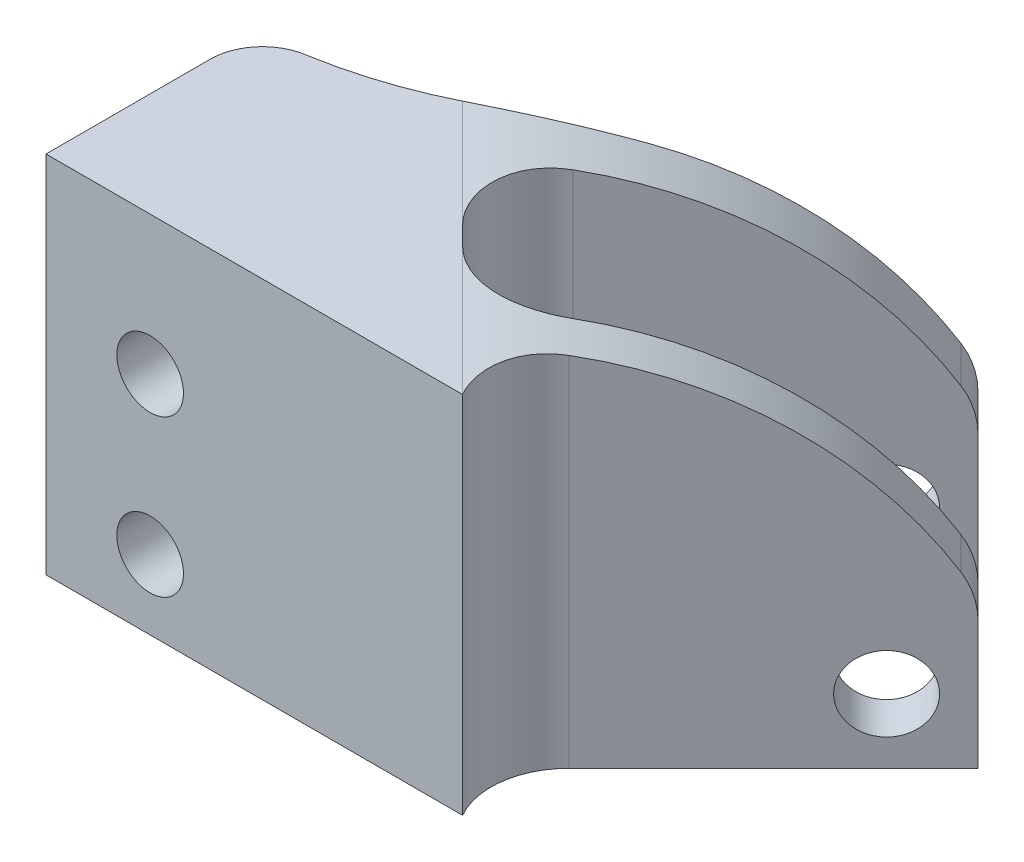
ISO-10303-21;
HEADER;
FILE_DESCRIPTION(('STEP AP214'),'2;1');
FILE_NAME('part.step','',(''),(''),'','','');
FILE_SCHEMA(('AUTOMOTIVE_DESIGN { 1 0 10303 214 1 1 1 1 }'));
ENDSEC;
DATA;
#1=APPLICATION_CONTEXT('core data for automotive mechanical design processes');
#2=APPLICATION_PROTOCOL_DEFINITION('international standard','automotive_design',2000,#1);
#3=PRODUCT_CONTEXT('',#1,'mechanical');
#4=PRODUCT('Part','Part','',(#3));
#5=PRODUCT_RELATED_PRODUCT_CATEGORY('part','',(#4));
#6=PRODUCT_DEFINITION_FORMATION('','',#4);
#7=PRODUCT_DEFINITION_CONTEXT('part definition',#1,'design');
#8=PRODUCT_DEFINITION('design','',#6,#7);
#9=PRODUCT_DEFINITION_SHAPE('','',#8);
#10=(LENGTH_UNIT() NAMED_UNIT(*) SI_UNIT(.MILLI.,.METRE.));
#11=(NAMED_UNIT(*) PLANE_ANGLE_UNIT() SI_UNIT($,.RADIAN.));
#12=(NAMED_UNIT(*) SI_UNIT($,.STERADIAN.) SOLID_ANGLE_UNIT());
#13=UNCERTAINTY_MEASURE_WITH_UNIT(LENGTH_MEASURE(1.E-05),#10,'distance_accuracy_value','');
#14=(GEOMETRIC_REPRESENTATION_CONTEXT(3) GLOBAL_UNCERTAINTY_ASSIGNED_CONTEXT((#13)) GLOBAL_UNIT_ASSIGNED_CONTEXT((#10,
#11,#12)) REPRESENTATION_CONTEXT('',''));
#15=CARTESIAN_POINT('',(0.,0.,0.));
#16=DIRECTION('',(0.,0.,1.));
#17=DIRECTION('',(1.,0.,0.));
#18=AXIS2_PLACEMENT_3D('',#15,#16,#17);
#19=CARTESIAN_POINT('',(0.,0.,-5.08));
#20=DIRECTION('',(0.,0.,-1.));
#21=DIRECTION('',(1.,0.,0.));
#22=AXIS2_PLACEMENT_3D('',#19,#20,#21);
#23=PLANE('',#22);
#24=DIRECTION('',(0.,-1.,0.));
#25=VECTOR('',#24,1.);
#26=CARTESIAN_POINT('',(0.,23.9453917035151,-5.08));
#27=LINE('',#26,#25);
#28=CARTESIAN_POINT('',(0.,23.9453917035151,-5.08));
#29=VERTEX_POINT('',#28);
#30=CARTESIAN_POINT('',(0.,1.72039170351506,-5.08));
#31=VERTEX_POINT('',#30);
#32=EDGE_CURVE('E282',#29,#31,#27,.T.);
#33=ORIENTED_EDGE('',*,*,#32,.T.);
#34=DIRECTION('',(1.,0.,0.));
#35=VECTOR('',#34,1.);
#36=CARTESIAN_POINT('',(0.,1.72039170351506,-5.08));
#37=LINE('',#36,#35);
#38=CARTESIAN_POINT('',(25.3999999999995,1.72039170351505,-5.08000000000032));
#39=VERTEX_POINT('',#38);
#40=EDGE_CURVE('E286',#31,#39,#37,.T.);
#41=ORIENTED_EDGE('',*,*,#40,.T.);
#42=DIRECTION('',(0.,1.,0.));
#43=VECTOR('',#42,1.);
#44=CARTESIAN_POINT('',(25.3999999999995,-47.3627415406213,-5.08000000000032));
#45=LINE('',#44,#43);
#46=CARTESIAN_POINT('',(25.3999999999995,23.9453917035151,-5.08000000000032));
#47=VERTEX_POINT('',#46);
#48=EDGE_CURVE('E214',#39,#47,#45,.T.);
#49=ORIENTED_EDGE('',*,*,#48,.T.);
#50=DIRECTION('',(-1.,0.,0.));
#51=VECTOR('',#50,1.);
#52=CARTESIAN_POINT('',(12.7,23.9453917035151,-5.08));
#53=LINE('',#52,#51);
#54=EDGE_CURVE('E290',#47,#29,#53,.T.);
#55=ORIENTED_EDGE('',*,*,#54,.T.);
#56=EDGE_LOOP('',(#33,#41,#49,#55));
#57=FACE_BOUND('',#56,.T.);
#58=CARTESIAN_POINT('',(6.34999999999984,15.4998917035151,-5.08));
#59=DIRECTION('',(0.,0.,1.));
#60=DIRECTION('',(1.,0.,0.));
#61=AXIS2_PLACEMENT_3D('',#58,#59,#60);
#62=CIRCLE('',#61,2.032);
#63=CARTESIAN_POINT('',(8.38199999999983,15.4998917035151,-5.08));
#64=VERTEX_POINT('',#63);
#65=EDGE_CURVE('E278',#64,#64,#62,.T.);
#66=ORIENTED_EDGE('',*,*,#65,.F.);
#67=EDGE_LOOP('',(#66));
#68=FACE_BOUND('',#67,.T.);
#69=CARTESIAN_POINT('',(6.34999999999984,5.97489170351506,-5.08));
#70=DIRECTION('',(0.,0.,1.));
#71=DIRECTION('',(1.,0.,0.));
#72=AXIS2_PLACEMENT_3D('',#69,#70,#71);
#73=CIRCLE('',#72,2.032);
#74=CARTESIAN_POINT('',(8.38199999999983,5.97489170351506,-5.08));
#75=VERTEX_POINT('',#74);
#76=EDGE_CURVE('E274',#75,#75,#73,.T.);
#77=ORIENTED_EDGE('',*,*,#76,.F.);
#78=EDGE_LOOP('',(#77));
#79=FACE_BOUND('',#78,.T.);
#80=ADVANCED_FACE('F53',(#57,#68,#79),#23,.F.);
#81=CARTESIAN_POINT('',(0.,23.9453917035151,-17.78));
#82=DIRECTION('',(1.,0.,0.));
#83=DIRECTION('',(0.,1.,0.));
#84=AXIS2_PLACEMENT_3D('',#81,#82,#83);
#85=PLANE('',#84);
#86=DIRECTION('',(0.,0.,1.));
#87=VECTOR('',#86,1.);
#88=CARTESIAN_POINT('',(0.,1.72039170351506,-17.78));
#89=LINE('',#88,#87);
#90=CARTESIAN_POINT('',(0.,1.72039170351506,-15.1038391044047));
#91=VERTEX_POINT('',#90);
#92=EDGE_CURVE('E297',#91,#31,#89,.T.);
#93=ORIENTED_EDGE('',*,*,#92,.T.);
#94=ORIENTED_EDGE('',*,*,#32,.F.);
#95=DIRECTION('',(0.,0.,1.));
#96=VECTOR('',#95,1.);
#97=CARTESIAN_POINT('',(0.,23.9453917035151,-17.78));
#98=LINE('',#97,#96);
#99=CARTESIAN_POINT('',(0.,23.9453917035151,-15.1038391044047));
#100=VERTEX_POINT('',#99);
#101=EDGE_CURVE('E294',#100,#29,#98,.T.);
#102=ORIENTED_EDGE('',*,*,#101,.F.);
#103=DIRECTION('',(0.,-1.,0.));
#104=VECTOR('',#103,1.);
#105=CARTESIAN_POINT('',(0.,23.9453917035151,-15.1038391044047));
#106=LINE('',#105,#104);
#107=EDGE_CURVE('E315',#91,#100,#106,.F.);
#108=ORIENTED_EDGE('',*,*,#107,.F.);
#109=EDGE_LOOP('',(#93,#94,#102,#108));
#110=FACE_BOUND('',#109,.T.);
#111=ADVANCED_FACE('F411',(#110),#85,.F.);
#112=CARTESIAN_POINT('',(0.,1.72039170351506,-17.78));
#113=DIRECTION('',(0.,1.,0.));
#114=DIRECTION('',(0.,0.,-1.));
#115=AXIS2_PLACEMENT_3D('',#112,#113,#114);
#116=PLANE('',#115);
#117=DIRECTION('',(-0.985568160157431,0.,0.16927906451743));
#118=VECTOR('',#117,1.);
#119=CARTESIAN_POINT('',(-2.11881791335409,1.72039170351506,-17.4160763986145));
#120=LINE('',#119,#118);
#121=CARTESIAN_POINT('',(2.88433610563662,1.72039170351506,-18.2754073573542));
#122=VERTEX_POINT('',#121);
#123=CARTESIAN_POINT('',(2.63753897015716,1.72039170351506,-18.2330180129045));
#124=VERTEX_POINT('',#123);
#125=EDGE_CURVE('E209',#122,#124,#120,.T.);
#126=ORIENTED_EDGE('',*,*,#125,.F.);
#127=CARTESIAN_POINT('',(-1.4153521331061,1.72039170351506,-43.3088386253529));
#128=DIRECTION('',(0.,-1.,0.));
#129=DIRECTION('',(0.,0.,-1.));
#130=AXIS2_PLACEMENT_3D('',#127,#128,#129);
#131=CIRCLE('',#130,25.4);
#132=CARTESIAN_POINT('',(16.5451601090321,1.72039170351506,-25.3483263832145));
#133=VERTEX_POINT('',#132);
#134=EDGE_CURVE('E12',#133,#122,#131,.T.);
#135=ORIENTED_EDGE('',*,*,#134,.F.);
#136=DIRECTION('',(-0.707106781186552,0.,0.707106781186543));
#137=VECTOR('',#136,1.);
#138=CARTESIAN_POINT('',(-1.86158313709132,1.72039170351506,-6.94158313709135));
#139=LINE('',#138,#137);
#140=CARTESIAN_POINT('',(26.5538650747799,1.72039170351506,-35.3570313489622));
#141=VERTEX_POINT('',#140);
#142=EDGE_CURVE('E213',#141,#133,#139,.T.);
#143=ORIENTED_EDGE('',*,*,#142,.F.);
#144=DIRECTION('',(-0.707106781186543,0.,-0.707106781186552));
#145=VECTOR('',#144,1.);
#146=CARTESIAN_POINT('',(28.4154482118712,1.72039170351505,-33.4954482118708));
#147=LINE('',#146,#145);
#148=CARTESIAN_POINT('',(28.7989291050471,1.72039170351505,-33.111967318695));
#149=VERTEX_POINT('',#148);
#150=EDGE_CURVE('E218',#149,#141,#147,.T.);
#151=ORIENTED_EDGE('',*,*,#150,.F.);
#152=DIRECTION('',(0.707106781186553,0.,-0.707106781186543));
#153=VECTOR('',#152,1.);
#154=CARTESIAN_POINT('',(0.383480893175854,1.72039170351506,-4.69651910682415));
#155=LINE('',#154,#153);
#156=CARTESIAN_POINT('',(16.4510769385769,1.72039170351506,-20.764115152225));
#157=VERTEX_POINT('',#156);
#158=EDGE_CURVE('E222',#157,#149,#155,.T.);
#159=ORIENTED_EDGE('',*,*,#158,.F.);
#160=CARTESIAN_POINT('',(19.8186729839778,1.72039170351505,-17.396519106824));
#161=DIRECTION('',(0.,-1.,0.));
#162=DIRECTION('',(0.,0.,-1.));
#163=AXIS2_PLACEMENT_3D('',#160,#161,#162);
#164=CIRCLE('',#163,4.7625);
#165=CARTESIAN_POINT('',(16.4510769385769,1.72039170351505,-14.0289230614231));
#166=VERTEX_POINT('',#165);
#167=EDGE_CURVE('E394',#166,#157,#164,.T.);
#168=ORIENTED_EDGE('',*,*,#167,.F.);
#169=DIRECTION('',(-0.707106781186543,0.,-0.707106781186552));
#170=VECTOR('',#169,1.);
#171=CARTESIAN_POINT('',(12.7000000000001,1.72039170351505,-17.7799999999999));
#172=LINE('',#171,#170);
#173=CARTESIAN_POINT('',(17.5736089537105,1.72039170351505,-12.9063910462894));
#174=VERTEX_POINT('',#173);
#175=EDGE_CURVE('E226',#174,#166,#172,.T.);
#176=ORIENTED_EDGE('',*,*,#175,.F.);
#177=CARTESIAN_POINT('',(20.9412049991114,1.72039170351505,-16.2739870916904));
#178=DIRECTION('',(0.,-1.,0.));
#179=DIRECTION('',(0.,0.,-1.));
#180=AXIS2_PLACEMENT_3D('',#177,#178,#179);
#181=CIRCLE('',#180,4.7625);
#182=CARTESIAN_POINT('',(24.3088010445124,1.72039170351505,-12.9063910462894));
#183=VERTEX_POINT('',#182);
#184=EDGE_CURVE('E395',#183,#174,#181,.T.);
#185=ORIENTED_EDGE('',*,*,#184,.F.);
#186=DIRECTION('',(-0.707106781186553,0.,0.707106781186542));
#187=VECTOR('',#186,1.);
#188=CARTESIAN_POINT('',(8.24120499911131,1.72039170351505,3.16120499911141));
#189=LINE('',#188,#187);
#190=CARTESIAN_POINT('',(36.6566532109825,1.72039170351505,-25.2542432127594));
#191=VERTEX_POINT('',#190);
#192=EDGE_CURVE('E230',#191,#183,#189,.T.);
#193=ORIENTED_EDGE('',*,*,#192,.F.);
#194=DIRECTION('',(-0.707106781186543,0.,-0.707106781186552));
#195=VECTOR('',#194,1.);
#196=CARTESIAN_POINT('',(28.4154482118712,1.72039170351505,-33.4954482118708));
#197=LINE('',#196,#195);
#198=CARTESIAN_POINT('',(38.6323095576177,1.72039170351505,-23.2785868661242));
#199=VERTEX_POINT('',#198);
#200=EDGE_CURVE('E234',#199,#191,#197,.T.);
#201=ORIENTED_EDGE('',*,*,#200,.F.);
#202=DIRECTION('',(0.707106781186552,0.,-0.707106781186543));
#203=VECTOR('',#202,1.);
#204=CARTESIAN_POINT('',(10.2168613457465,1.72039170351505,5.13686134574664));
#205=LINE('',#204,#203);
#206=CARTESIAN_POINT('',(26.1662364007755,1.72039170351505,-10.8125137092822));
#207=VERTEX_POINT('',#206);
#208=EDGE_CURVE('E238',#207,#199,#205,.T.);
#209=ORIENTED_EDGE('',*,*,#208,.F.);
#210=CARTESIAN_POINT('',(29.5338324461765,1.72039170351505,-7.44491766388122));
#211=DIRECTION('',(0.,-1.,0.));
#212=DIRECTION('',(0.,0.,-1.));
#213=AXIS2_PLACEMENT_3D('',#210,#211,#212);
#214=CIRCLE('',#213,4.7625);
#215=EDGE_CURVE('E159',#39,#207,#214,.T.);
#216=ORIENTED_EDGE('',*,*,#215,.F.);
#217=ORIENTED_EDGE('',*,*,#40,.F.);
#218=ORIENTED_EDGE('',*,*,#92,.F.);
#219=CARTESIAN_POINT('',(3.175,1.72039170351506,-15.1038391044047));
#220=DIRECTION('',(0.,-1.,0.));
#221=DIRECTION('',(0.,0.,-1.));
#222=AXIS2_PLACEMENT_3D('',#219,#220,#221);
#223=CIRCLE('',#222,3.175);
#224=EDGE_CURVE('E312',#124,#91,#223,.F.);
#225=ORIENTED_EDGE('',*,*,#224,.F.);
#226=EDGE_LOOP('',(#126,#135,#143,#151,#159,#168,#176,#185,#193,#201,#209,#216,#217,#218,#225));
#227=FACE_BOUND('',#226,.T.);
#228=ADVANCED_FACE('F417',(#227),#116,.F.);
#229=CARTESIAN_POINT('',(12.7,23.9453917035151,-17.78));
#230=DIRECTION('',(0.,-1.,0.));
#231=DIRECTION('',(1.,0.,0.));
#232=AXIS2_PLACEMENT_3D('',#229,#230,#231);
#233=PLANE('',#232);
#234=ORIENTED_EDGE('',*,*,#101,.T.);
#235=ORIENTED_EDGE('',*,*,#54,.F.);
#236=DIRECTION('',(-0.707106781186542,0.,-0.707106781186553));
#237=VECTOR('',#236,1.);
#238=CARTESIAN_POINT('',(32.0161547788087,23.9453917035151,1.53615477880896));
#239=LINE('',#238,#237);
#240=CARTESIAN_POINT('',(17.5736089537105,23.9453917035151,-12.9063910462894));
#241=VERTEX_POINT('',#240);
#242=EDGE_CURVE('E154',#47,#241,#239,.T.);
#243=ORIENTED_EDGE('',*,*,#242,.T.);
#244=DIRECTION('',(0.707106781186543,0.,0.707106781186552));
#245=VECTOR('',#244,1.);
#246=CARTESIAN_POINT('',(12.7000000000001,23.9453917035151,-17.7799999999999));
#247=LINE('',#246,#245);
#248=CARTESIAN_POINT('',(16.4510769385768,23.9453917035151,-14.0289230614231));
#249=VERTEX_POINT('',#248);
#250=EDGE_CURVE('E245',#249,#241,#247,.T.);
#251=ORIENTED_EDGE('',*,*,#250,.F.);
#252=CARTESIAN_POINT('',(9.90767506910083,23.9453917035151,-20.5723249308992));
#253=VERTEX_POINT('',#252);
#254=EDGE_CURVE('E185',#249,#253,#239,.T.);
#255=ORIENTED_EDGE('',*,*,#254,.T.);
#256=CARTESIAN_POINT('',(-1.41535213310611,23.9453917035151,-43.3088386253529));
#257=DIRECTION('',(0.,1.,0.));
#258=DIRECTION('',(1.,0.,0.));
#259=AXIS2_PLACEMENT_3D('',#256,#257,#258);
#260=CIRCLE('',#259,25.4);
#261=CARTESIAN_POINT('',(2.88433610563661,23.9453917035151,-18.2754073573542));
#262=VERTEX_POINT('',#261);
#263=EDGE_CURVE('E513',#262,#253,#260,.T.);
#264=ORIENTED_EDGE('',*,*,#263,.F.);
#265=DIRECTION('',(0.985568160157431,0.,-0.16927906451743));
#266=VECTOR('',#265,1.);
#267=CARTESIAN_POINT('',(-2.11881791335411,23.9453917035151,-17.4160763986145));
#268=LINE('',#267,#266);
#269=CARTESIAN_POINT('',(2.63753897015716,23.9453917035151,-18.2330180129045));
#270=VERTEX_POINT('',#269);
#271=EDGE_CURVE('E208',#270,#262,#268,.T.);
#272=ORIENTED_EDGE('',*,*,#271,.F.);
#273=CARTESIAN_POINT('',(3.175,23.9453917035151,-15.1038391044047));
#274=DIRECTION('',(0.,1.,0.));
#275=DIRECTION('',(1.,0.,0.));
#276=AXIS2_PLACEMENT_3D('',#273,#274,#275);
#277=CIRCLE('',#276,3.175);
#278=EDGE_CURVE('E101',#100,#270,#277,.F.);
#279=ORIENTED_EDGE('',*,*,#278,.F.);
#280=EDGE_LOOP('',(#234,#235,#243,#251,#255,#264,#272,#279));
#281=FACE_BOUND('',#280,.T.);
#282=ADVANCED_FACE('F425',(#281),#233,.F.);
#283=CARTESIAN_POINT('',(6.34999999999984,15.4998917035151,-17.78));
#284=DIRECTION('',(0.,0.,1.));
#285=DIRECTION('',(-1.,0.,0.));
#286=AXIS2_PLACEMENT_3D('',#283,#284,#285);
#287=CYLINDRICAL_SURFACE('',#286,2.032);
#288=CARTESIAN_POINT('',(6.34999999999984,15.4998917035151,-17.78));
#289=DIRECTION('',(0.,0.,1.));
#290=DIRECTION('',(1.,0.,0.));
#291=AXIS2_PLACEMENT_3D('',#288,#289,#290);
#292=CIRCLE('',#291,2.032);
#293=CARTESIAN_POINT('',(8.38199999999983,15.4998917035151,-17.78));
#294=VERTEX_POINT('',#293);
#295=EDGE_CURVE('E270',#294,#294,#292,.T.);
#296=ORIENTED_EDGE('',*,*,#295,.F.);
#297=EDGE_LOOP('',(#296));
#298=FACE_BOUND('',#297,.T.);
#299=ORIENTED_EDGE('',*,*,#65,.T.);
#300=EDGE_LOOP('',(#299));
#301=FACE_BOUND('',#300,.T.);
#302=ADVANCED_FACE('F423',(#298,#301),#287,.F.);
#303=CARTESIAN_POINT('',(6.34999999999984,5.97489170351506,-17.78));
#304=DIRECTION('',(0.,0.,1.));
#305=DIRECTION('',(-1.,0.,0.));
#306=AXIS2_PLACEMENT_3D('',#303,#304,#305);
#307=CYLINDRICAL_SURFACE('',#306,2.032);
#308=CARTESIAN_POINT('',(6.34999999999984,5.97489170351506,-17.78));
#309=DIRECTION('',(0.,0.,1.));
#310=DIRECTION('',(1.,0.,0.));
#311=AXIS2_PLACEMENT_3D('',#308,#309,#310);
#312=CIRCLE('',#311,2.032);
#313=CARTESIAN_POINT('',(8.38199999999983,5.97489170351506,-17.78));
#314=VERTEX_POINT('',#313);
#315=EDGE_CURVE('E241',#314,#314,#312,.T.);
#316=ORIENTED_EDGE('',*,*,#315,.F.);
#317=EDGE_LOOP('',(#316));
#318=FACE_BOUND('',#317,.T.);
#319=ORIENTED_EDGE('',*,*,#76,.T.);
#320=EDGE_LOOP('',(#319));
#321=FACE_BOUND('',#320,.T.);
#322=ADVANCED_FACE('F566',(#318,#321),#307,.F.);
#323=CARTESIAN_POINT('',(0.,-47.3627415406213,-17.78));
#324=DIRECTION('',(0.,0.,-1.));
#325=DIRECTION('',(1.,0.,0.));
#326=AXIS2_PLACEMENT_3D('',#323,#324,#325);
#327=PLANE('',#326);
#328=ORIENTED_EDGE('',*,*,#315,.T.);
#329=EDGE_LOOP('',(#328));
#330=FACE_BOUND('',#329,.T.);
#331=ADVANCED_FACE('F564',(#330),#327,.F.);
#332=ORIENTED_EDGE('',*,*,#295,.T.);
#333=EDGE_LOOP('',(#332));
#334=FACE_BOUND('',#333,.T.);
#335=ADVANCED_FACE('F562',(#334),#327,.F.);
#336=CARTESIAN_POINT('',(-2.11881791335409,-47.3627415406213,-17.4160763986145));
#337=DIRECTION('',(-0.16927906451743,0.,-0.985568160157431));
#338=DIRECTION('',(0.985568160157431,0.,-0.16927906451743));
#339=AXIS2_PLACEMENT_3D('',#336,#337,#338);
#340=PLANE('',#339);
#341=ORIENTED_EDGE('',*,*,#271,.T.);
#342=DIRECTION('',(0.,1.,0.));
#343=VECTOR('',#342,1.);
#344=CARTESIAN_POINT('',(2.88433610563662,23.9453917035151,-18.2754073573542));
#345=LINE('',#344,#343);
#346=EDGE_CURVE('E301',#122,#262,#345,.T.);
#347=ORIENTED_EDGE('',*,*,#346,.F.);
#348=ORIENTED_EDGE('',*,*,#125,.T.);
#349=DIRECTION('',(0.,-1.,0.));
#350=VECTOR('',#349,1.);
#351=CARTESIAN_POINT('',(2.63753897015716,1.72039170351505,-18.2330180129045));
#352=LINE('',#351,#350);
#353=EDGE_CURVE('E308',#270,#124,#352,.T.);
#354=ORIENTED_EDGE('',*,*,#353,.F.);
#355=EDGE_LOOP('',(#341,#347,#348,#354));
#356=FACE_BOUND('',#355,.T.);
#357=ADVANCED_FACE('F511',(#356),#340,.T.);
#358=CARTESIAN_POINT('',(-1.86158313709131,-47.3627415406213,-6.94158313709135));
#359=DIRECTION('',(-0.707106781186543,0.,-0.707106781186552));
#360=DIRECTION('',(0.707106781186552,0.,-0.707106781186543));
#361=AXIS2_PLACEMENT_3D('',#358,#359,#360);
#362=PLANE('',#361);
#363=DIRECTION('',(0.,1.,0.));
#364=VECTOR('',#363,1.);
#365=CARTESIAN_POINT('',(26.5538650747799,-47.3627415406213,-35.3570313489622));
#366=LINE('',#365,#364);
#367=CARTESIAN_POINT('',(26.5538650747799,9.54391433157739,-35.3570313489622));
#368=VERTEX_POINT('',#367);
#369=EDGE_CURVE('E249',#141,#368,#366,.T.);
#370=ORIENTED_EDGE('',*,*,#369,.F.);
#371=ORIENTED_EDGE('',*,*,#142,.T.);
#372=DIRECTION('',(0.,1.,0.));
#373=VECTOR('',#372,1.);
#374=CARTESIAN_POINT('',(16.5451601090321,1.72039170351507,-25.3483263832145));
#375=LINE('',#374,#373);
#376=CARTESIAN_POINT('',(16.5451601090321,22.6291240356444,-25.3483263832145));
#377=VERTEX_POINT('',#376);
#378=EDGE_CURVE('E323',#377,#133,#375,.F.);
#379=ORIENTED_EDGE('',*,*,#378,.F.);
#380=CARTESIAN_POINT('',(10.8384168629088,-1.45460829648494,-19.6415831370913));
#381=DIRECTION('',(0.707106781186543,0.,0.707106781186552));
#382=DIRECTION('',(0.707106781186552,0.,-0.707106781186543));
#383=AXIS2_PLACEMENT_3D('',#380,#381,#382);
#384=CIRCLE('',#383,25.4);
#385=CARTESIAN_POINT('',(26.0357733754874,12.0820349380533,-34.8389396496697));
#386=VERTEX_POINT('',#385);
#387=EDGE_CURVE('E191',#377,#386,#384,.F.);
#388=ORIENTED_EDGE('',*,*,#387,.T.);
#389=CARTESIAN_POINT('',(23.1862690293789,9.5439143315774,-31.9894353035613));
#390=DIRECTION('',(0.707106781186543,0.,0.707106781186552));
#391=DIRECTION('',(0.707106781186552,0.,-0.707106781186543));
#392=AXIS2_PLACEMENT_3D('',#389,#390,#391);
#393=CIRCLE('',#392,4.7625);
#394=EDGE_CURVE('E327',#368,#386,#393,.T.);
#395=ORIENTED_EDGE('',*,*,#394,.F.);
#396=EDGE_LOOP('',(#370,#371,#379,#388,#395));
#397=FACE_BOUND('',#396,.T.);
#398=CARTESIAN_POINT('',(23.7666550833501,5.65739169613365,-32.5698213575324));
#399=DIRECTION('',(0.707106781186543,0.,0.707106781186552));
#400=DIRECTION('',(0.707106781186552,0.,-0.707106781186543));
#401=AXIS2_PLACEMENT_3D('',#398,#399,#400);
#402=CIRCLE('',#401,2.28599999960919);
#403=CARTESIAN_POINT('',(25.3831011848662,5.65739169613365,-34.1862674590485));
#404=VERTEX_POINT('',#403);
#405=EDGE_CURVE('E204',#404,#404,#402,.T.);
#406=ORIENTED_EDGE('',*,*,#405,.T.);
#407=EDGE_LOOP('',(#406));
#408=FACE_BOUND('',#407,.T.);
#409=ADVANCED_FACE('F504',(#397,#408),#362,.T.);
#410=CARTESIAN_POINT('',(28.4154482118712,-47.3627415406213,-33.4954482118708));
#411=DIRECTION('',(0.707106781186552,0.,-0.707106781186543));
#412=DIRECTION('',(0.707106781186543,0.,0.707106781186552));
#413=AXIS2_PLACEMENT_3D('',#410,#411,#412);
#414=PLANE('',#413);
#415=DIRECTION('',(0.,1.,0.));
#416=VECTOR('',#415,1.);
#417=CARTESIAN_POINT('',(28.7989291050471,-47.3627415406213,-33.111967318695));
#418=LINE('',#417,#416);
#419=CARTESIAN_POINT('',(28.7989291050471,9.54391433157739,-33.111967318695));
#420=VERTEX_POINT('',#419);
#421=EDGE_CURVE('E260',#149,#420,#418,.T.);
#422=ORIENTED_EDGE('',*,*,#421,.F.);
#423=ORIENTED_EDGE('',*,*,#150,.T.);
#424=ORIENTED_EDGE('',*,*,#369,.T.);
#425=DIRECTION('',(0.707106781186543,0.,0.707106781186552));
#426=VECTOR('',#425,1.);
#427=CARTESIAN_POINT('',(26.5538650747799,9.54391433157741,-35.3570313489622));
#428=LINE('',#427,#426);
#429=EDGE_CURVE('E320',#420,#368,#428,.F.);
#430=ORIENTED_EDGE('',*,*,#429,.F.);
#431=EDGE_LOOP('',(#422,#423,#424,#430));
#432=FACE_BOUND('',#431,.T.);
#433=ADVANCED_FACE('F529',(#432),#414,.T.);
#434=CARTESIAN_POINT('',(0.383480893175861,-47.3627415406213,-4.69651910682415));
#435=DIRECTION('',(0.707106781186542,0.,0.707106781186552));
#436=DIRECTION('',(-0.707106781186553,0.,0.707106781186543));
#437=AXIS2_PLACEMENT_3D('',#434,#435,#436);
#438=PLANE('',#437);
#439=CARTESIAN_POINT('',(13.0834808931759,-1.45460829648494,-17.3965191068241));
#440=DIRECTION('',(-0.707106781186542,0.,-0.707106781186552));
#441=DIRECTION('',(-0.707106781186553,0.,0.707106781186543));
#442=AXIS2_PLACEMENT_3D('',#439,#440,#441);
#443=CIRCLE('',#442,25.4);
#444=CARTESIAN_POINT('',(28.2808374057546,12.0820349380533,-32.5938756194025));
#445=VERTEX_POINT('',#444);
#446=CARTESIAN_POINT('',(16.4510769385769,23.494912615749,-20.764115152225));
#447=VERTEX_POINT('',#446);
#448=EDGE_CURVE('E183',#445,#447,#443,.F.);
#449=ORIENTED_EDGE('',*,*,#448,.T.);
#450=DIRECTION('',(0.,1.,0.));
#451=VECTOR('',#450,1.);
#452=CARTESIAN_POINT('',(16.4510769385769,23.9453917035151,-20.764115152225));
#453=LINE('',#452,#451);
#454=EDGE_CURVE('E334',#157,#447,#453,.T.);
#455=ORIENTED_EDGE('',*,*,#454,.F.);
#456=ORIENTED_EDGE('',*,*,#158,.T.);
#457=ORIENTED_EDGE('',*,*,#421,.T.);
#458=CARTESIAN_POINT('',(25.4313330596461,9.5439143315774,-29.7443712732941));
#459=DIRECTION('',(-0.707106781186542,0.,-0.707106781186552));
#460=DIRECTION('',(-0.707106781186553,0.,0.707106781186543));
#461=AXIS2_PLACEMENT_3D('',#458,#459,#460);
#462=CIRCLE('',#461,4.7625);
#463=EDGE_CURVE('E338',#445,#420,#462,.T.);
#464=ORIENTED_EDGE('',*,*,#463,.F.);
#465=EDGE_LOOP('',(#449,#455,#456,#457,#464));
#466=FACE_BOUND('',#465,.T.);
#467=CARTESIAN_POINT('',(26.0117191136172,5.65739169613366,-30.3247573272652));
#468=DIRECTION('',(-0.707106781186542,0.,-0.707106781186552));
#469=DIRECTION('',(-0.707106781186553,0.,0.707106781186543));
#470=AXIS2_PLACEMENT_3D('',#467,#468,#469);
#471=CIRCLE('',#470,2.28599999960919);
#472=CARTESIAN_POINT('',(24.3952730121011,5.65739169613366,-28.7083112257491));
#473=VERTEX_POINT('',#472);
#474=EDGE_CURVE('E200',#473,#473,#471,.T.);
#475=ORIENTED_EDGE('',*,*,#474,.T.);
#476=EDGE_LOOP('',(#475));
#477=FACE_BOUND('',#476,.T.);
#478=ADVANCED_FACE('F525',(#466,#477),#438,.T.);
#479=CARTESIAN_POINT('',(12.7000000000001,-47.3627415406213,-17.7799999999999));
#480=DIRECTION('',(0.707106781186552,0.,-0.707106781186543));
#481=DIRECTION('',(0.707106781186543,0.,0.707106781186552));
#482=AXIS2_PLACEMENT_3D('',#479,#480,#481);
#483=PLANE('',#482);
#484=ORIENTED_EDGE('',*,*,#175,.T.);
#485=DIRECTION('',(0.,1.,0.));
#486=VECTOR('',#485,1.);
#487=CARTESIAN_POINT('',(16.4510769385769,1.72039170351506,-14.0289230614231));
#488=LINE('',#487,#486);
#489=EDGE_CURVE('E355',#249,#166,#488,.F.);
#490=ORIENTED_EDGE('',*,*,#489,.F.);
#491=ORIENTED_EDGE('',*,*,#250,.T.);
#492=DIRECTION('',(0.,1.,0.));
#493=VECTOR('',#492,1.);
#494=CARTESIAN_POINT('',(17.5736089537105,23.9453917035151,-12.9063910462894));
#495=LINE('',#494,#493);
#496=EDGE_CURVE('E160',#174,#241,#495,.T.);
#497=ORIENTED_EDGE('',*,*,#496,.F.);
#498=EDGE_LOOP('',(#484,#490,#491,#497));
#499=FACE_BOUND('',#498,.T.);
#500=ADVANCED_FACE('F540',(#499),#483,.T.);
#501=CARTESIAN_POINT('',(8.24120499911131,-47.3627415406213,3.16120499911142));
#502=DIRECTION('',(-0.707106781186542,0.,-0.707106781186553));
#503=DIRECTION('',(0.707106781186553,0.,-0.707106781186542));
#504=AXIS2_PLACEMENT_3D('',#501,#502,#503);
#505=PLANE('',#504);
#506=DIRECTION('',(0.,1.,0.));
#507=VECTOR('',#506,1.);
#508=CARTESIAN_POINT('',(36.6566532109825,-47.3627415406213,-25.2542432127594));
#509=LINE('',#508,#507);
#510=CARTESIAN_POINT('',(36.6566532109825,9.5439143315774,-25.2542432127594));
#511=VERTEX_POINT('',#510);
#512=EDGE_CURVE('E256',#191,#511,#509,.T.);
#513=ORIENTED_EDGE('',*,*,#512,.F.);
#514=ORIENTED_EDGE('',*,*,#192,.T.);
#515=DIRECTION('',(0.,1.,0.));
#516=VECTOR('',#515,1.);
#517=CARTESIAN_POINT('',(24.3088010445124,1.72039170351505,-12.9063910462894));
#518=LINE('',#517,#516);
#519=CARTESIAN_POINT('',(24.3088010445123,23.494912615749,-12.9063910462894));
#520=VERTEX_POINT('',#519);
#521=EDGE_CURVE('E344',#520,#183,#518,.F.);
#522=ORIENTED_EDGE('',*,*,#521,.F.);
#523=CARTESIAN_POINT('',(20.9412049991114,-1.45460829648493,-9.53879500088848));
#524=DIRECTION('',(0.707106781186542,0.,0.707106781186553));
#525=DIRECTION('',(0.707106781186553,0.,-0.707106781186542));
#526=AXIS2_PLACEMENT_3D('',#523,#524,#525);
#527=CIRCLE('',#526,25.4);
#528=CARTESIAN_POINT('',(36.1385615116901,12.0820349380533,-24.736151513467));
#529=VERTEX_POINT('',#528);
#530=EDGE_CURVE('E178',#520,#529,#527,.F.);
#531=ORIENTED_EDGE('',*,*,#530,.T.);
#532=CARTESIAN_POINT('',(33.2890571655816,9.54391433157741,-21.8866471673585));
#533=DIRECTION('',(0.707106781186542,0.,0.707106781186553));
#534=DIRECTION('',(0.707106781186553,0.,-0.707106781186542));
#535=AXIS2_PLACEMENT_3D('',#532,#533,#534);
#536=CIRCLE('',#535,4.7625);
#537=EDGE_CURVE('E348',#511,#529,#536,.T.);
#538=ORIENTED_EDGE('',*,*,#537,.F.);
#539=EDGE_LOOP('',(#513,#514,#522,#531,#538));
#540=FACE_BOUND('',#539,.T.);
#541=CARTESIAN_POINT('',(33.8694432195527,5.65739169613366,-22.4670332213296));
#542=DIRECTION('',(0.707106781186542,0.,0.707106781186553));
#543=DIRECTION('',(0.707106781186553,0.,-0.707106781186542));
#544=AXIS2_PLACEMENT_3D('',#541,#542,#543);
#545=CIRCLE('',#544,2.28599999960919);
#546=CARTESIAN_POINT('',(35.4858893210688,5.65739169613366,-24.0834793228457));
#547=VERTEX_POINT('',#546);
#548=EDGE_CURVE('E196',#547,#547,#545,.T.);
#549=ORIENTED_EDGE('',*,*,#548,.T.);
#550=EDGE_LOOP('',(#549));
#551=FACE_BOUND('',#550,.T.);
#552=ADVANCED_FACE('F537',(#540,#551),#505,.T.);
#553=CARTESIAN_POINT('',(28.4154482118712,-47.3627415406213,-33.4954482118708));
#554=DIRECTION('',(0.707106781186552,0.,-0.707106781186543));
#555=DIRECTION('',(0.707106781186543,0.,0.707106781186552));
#556=AXIS2_PLACEMENT_3D('',#553,#554,#555);
#557=PLANE('',#556);
#558=DIRECTION('',(0.,1.,0.));
#559=VECTOR('',#558,1.);
#560=CARTESIAN_POINT('',(38.6323095576177,-47.3627415406213,-23.2785868661242));
#561=LINE('',#560,#559);
#562=CARTESIAN_POINT('',(38.6323095576177,9.5439143315774,-23.2785868661242));
#563=VERTEX_POINT('',#562);
#564=EDGE_CURVE('E253',#199,#563,#561,.T.);
#565=ORIENTED_EDGE('',*,*,#564,.F.);
#566=ORIENTED_EDGE('',*,*,#200,.T.);
#567=ORIENTED_EDGE('',*,*,#512,.T.);
#568=DIRECTION('',(0.707106781186543,0.,0.707106781186552));
#569=VECTOR('',#568,1.);
#570=CARTESIAN_POINT('',(36.6566532109825,9.54391433157742,-25.2542432127594));
#571=LINE('',#570,#569);
#572=EDGE_CURVE('E341',#563,#511,#571,.F.);
#573=ORIENTED_EDGE('',*,*,#572,.F.);
#574=EDGE_LOOP('',(#565,#566,#567,#573));
#575=FACE_BOUND('',#574,.T.);
#576=ADVANCED_FACE('F445',(#575),#557,.T.);
#577=CARTESIAN_POINT('',(10.2168613457465,-47.3627415406213,5.13686134574665));
#578=DIRECTION('',(0.707106781186543,0.,0.707106781186552));
#579=DIRECTION('',(-0.707106781186552,0.,0.707106781186543));
#580=AXIS2_PLACEMENT_3D('',#577,#578,#579);
#581=PLANE('',#580);
#582=CARTESIAN_POINT('',(22.9168613457466,-1.45460829648493,-7.56313865425326));
#583=DIRECTION('',(-0.707106781186543,0.,-0.707106781186552));
#584=DIRECTION('',(-0.707106781186552,0.,0.707106781186543));
#585=AXIS2_PLACEMENT_3D('',#582,#583,#584);
#586=CIRCLE('',#585,25.4);
#587=CARTESIAN_POINT('',(38.1142178583253,12.0820349380533,-22.7604951668317));
#588=VERTEX_POINT('',#587);
#589=CARTESIAN_POINT('',(26.1662364007755,23.5262468430717,-10.8125137092822));
#590=VERTEX_POINT('',#589);
#591=EDGE_CURVE('E152',#588,#590,#586,.F.);
#592=ORIENTED_EDGE('',*,*,#591,.T.);
#593=DIRECTION('',(0.,1.,0.));
#594=VECTOR('',#593,1.);
#595=CARTESIAN_POINT('',(26.1662364007755,23.9453917035151,-10.8125137092822));
#596=LINE('',#595,#594);
#597=EDGE_CURVE('E164',#207,#590,#596,.T.);
#598=ORIENTED_EDGE('',*,*,#597,.F.);
#599=ORIENTED_EDGE('',*,*,#208,.T.);
#600=ORIENTED_EDGE('',*,*,#564,.T.);
#601=CARTESIAN_POINT('',(35.2647135122168,9.54391433157742,-19.9109908207233));
#602=DIRECTION('',(-0.707106781186543,0.,-0.707106781186552));
#603=DIRECTION('',(-0.707106781186552,0.,0.707106781186543));
#604=AXIS2_PLACEMENT_3D('',#601,#602,#603);
#605=CIRCLE('',#604,4.7625);
#606=EDGE_CURVE('E172',#588,#563,#605,.T.);
#607=ORIENTED_EDGE('',*,*,#606,.F.);
#608=EDGE_LOOP('',(#592,#598,#599,#600,#607));
#609=FACE_BOUND('',#608,.T.);
#610=CARTESIAN_POINT('',(35.8450995661879,5.65739169613366,-20.4913768746944));
#611=DIRECTION('',(-0.707106781186543,0.,-0.707106781186552));
#612=DIRECTION('',(-0.707106781186552,0.,0.707106781186543));
#613=AXIS2_PLACEMENT_3D('',#610,#611,#612);
#614=CIRCLE('',#613,2.28599999960919);
#615=CARTESIAN_POINT('',(34.2286534646718,5.65739169613366,-18.8749307731783));
#616=VERTEX_POINT('',#615);
#617=EDGE_CURVE('E195',#616,#616,#614,.T.);
#618=ORIENTED_EDGE('',*,*,#617,.T.);
#619=EDGE_LOOP('',(#618));
#620=FACE_BOUND('',#619,.T.);
#621=ADVANCED_FACE('F174',(#609,#620),#581,.T.);
#622=CARTESIAN_POINT('',(44.94439299925,5.65739169613366,-11.3920834416322));
#623=DIRECTION('',(-0.707106781186542,0.,-0.707106781186553));
#624=DIRECTION('',(0.707106781186553,0.,-0.707106781186542));
#625=AXIS2_PLACEMENT_3D('',#622,#623,#624);
#626=CYLINDRICAL_SURFACE('',#625,2.28599999960919);
#627=ORIENTED_EDGE('',*,*,#548,.F.);
#628=EDGE_LOOP('',(#627));
#629=FACE_BOUND('',#628,.T.);
#630=ORIENTED_EDGE('',*,*,#617,.F.);
#631=EDGE_LOOP('',(#630));
#632=FACE_BOUND('',#631,.T.);
#633=ADVANCED_FACE('F376',(#629,#632),#626,.F.);
#634=ORIENTED_EDGE('',*,*,#405,.F.);
#635=EDGE_LOOP('',(#634));
#636=FACE_BOUND('',#635,.T.);
#637=ORIENTED_EDGE('',*,*,#474,.F.);
#638=EDGE_LOOP('',(#637));
#639=FACE_BOUND('',#638,.T.);
#640=ADVANCED_FACE('F375',(#636,#639),#626,.F.);
#641=CARTESIAN_POINT('',(32.0161547788087,-1.45460829648493,1.53615477880896));
#642=DIRECTION('',(-0.707106781186542,0.,-0.707106781186553));
#643=DIRECTION('',(0.707106781186553,0.,-0.707106781186542));
#644=AXIS2_PLACEMENT_3D('',#641,#642,#643);
#645=CYLINDRICAL_SURFACE('',#644,25.4);
#646=ORIENTED_EDGE('',*,*,#530,.F.);
#647=CARTESIAN_POINT('',(17.5736089537105,23.9453917035151,-12.9063910462894));
#648=CARTESIAN_POINT('',(17.668283034432,23.9453837315597,-12.8116966235462));
#649=CARTESIAN_POINT('',(17.7669688257003,23.9453914531514,-12.7210168258444));
#650=CARTESIAN_POINT('',(17.9716164662538,23.945380667931,-12.5482869444659));
#651=CARTESIAN_POINT('',(18.0775779770938,23.9453621623382,-12.4662364598277));
#652=CARTESIAN_POINT('',(18.2959627710756,23.9452413591876,-12.3114105373413));
#653=CARTESIAN_POINT('',(18.4083815152729,23.9451391198339,-12.2386286973612));
#654=CARTESIAN_POINT('',(18.6389449521777,23.9447396514265,-12.1027876052438));
#655=CARTESIAN_POINT('',(18.7570895748193,23.9444424247581,-12.0397282341751));
#656=CARTESIAN_POINT('',(18.9983062250072,23.9435067163581,-11.9237611767495));
#657=CARTESIAN_POINT('',(19.1213798327529,23.9428681243637,-11.8708567780112));
#658=CARTESIAN_POINT('',(19.3715882165578,23.9410693308205,-11.7755833646991));
#659=CARTESIAN_POINT('',(19.498724478332,23.9399089363726,-11.7332182552776));
#660=CARTESIAN_POINT('',(19.7560371563401,23.9368609724102,-11.6593701316083));
#661=CARTESIAN_POINT('',(19.8862119076019,23.934973792748,-11.6278813004014));
#662=CARTESIAN_POINT('',(20.1487824550465,23.9302464607707,-11.5759674304979));
#663=CARTESIAN_POINT('',(20.2811790493589,23.9274059587273,-11.5555464592676));
#664=CARTESIAN_POINT('',(20.5469463585673,23.9205429642036,-11.525954829544));
#665=CARTESIAN_POINT('',(20.6803148289968,23.9165226593374,-11.5167635102336));
#666=CARTESIAN_POINT('',(20.9473526602518,23.9070608065724,-11.5096177782351));
#667=CARTESIAN_POINT('',(21.0810221146341,23.9016187299526,-11.5116675515054));
#668=CARTESIAN_POINT('',(21.347598577901,23.8890883767069,-11.5269807420353));
#669=CARTESIAN_POINT('',(21.4805058092107,23.8820006082878,-11.5402407008048));
#670=CARTESIAN_POINT('',(21.7446760156999,23.8659654682469,-11.5778560271892));
#671=CARTESIAN_POINT('',(21.8759383919885,23.8570174390336,-11.6022153219941));
#672=CARTESIAN_POINT('',(22.1350104116791,23.8371418822899,-11.661635411642));
#673=CARTESIAN_POINT('',(22.2628363271209,23.8262268698438,-11.6966294565432));
#674=CARTESIAN_POINT('',(22.5149463451881,23.8022368980084,-11.7770710876875));
#675=CARTESIAN_POINT('',(22.6392304324951,23.789161929279,-11.8225187191345));
#676=CARTESIAN_POINT('',(22.8833418073599,23.7607520508761,-11.9234759222255));
#677=CARTESIAN_POINT('',(23.0031702432416,23.7454177286171,-11.9789828793824));
#678=CARTESIAN_POINT('',(23.2375204419894,23.7124405806353,-12.0995748867458));
#679=CARTESIAN_POINT('',(23.3520432087808,23.6947981940744,-12.1646581151415));
#680=CARTESIAN_POINT('',(23.6172431646118,23.650071830722,-12.3302570788952));
#681=CARTESIAN_POINT('',(23.7652270960558,23.6219394508003,-12.4348679988339));
#682=CARTESIAN_POINT('',(23.9769934851988,23.5765954955514,-12.6033549286335));
#683=CARTESIAN_POINT('',(24.0458458234435,23.5609660199272,-12.6614107519306));
#684=CARTESIAN_POINT('',(24.1800132169832,23.5286921548161,-12.7811936837759));
#685=CARTESIAN_POINT('',(24.2453287231335,23.5120478952658,-12.8429203222748));
#686=CARTESIAN_POINT('',(24.3088010445124,23.494912615749,-12.9063910462894));
#687=B_SPLINE_CURVE_WITH_KNOTS('',3,(#647,#648,#649,#650,#651,#652,#653,#654,#655,#656,#657,
#658,#659,#660,#661,#662,#663,#664,#665,#666,#667,#668,#669,#670,#671,#672,#673,#674,#675,#676,
#677,#678,#679,#680,#681,#682,#683,#684,#685,#686),.UNSPECIFIED.,.F.,.F.,(4,2,2,2,2,2,2,2,2,2,2,
2,2,2,2,2,2,2,2,4),(0.,0.401588738723035,0.803158809348672,1.20444998135029,1.60573624411714,
2.00715220288119,2.40871667862709,2.81006605190154,3.21156282223762,3.61231978300271,
4.01322598778674,4.414008552832,4.81493303384362,5.21339130497104,5.61185129916305,
6.01020787902845,6.40848877241624,6.95728949370581,7.23139017373209,7.50545583030949),.UNSPECIFIED.);
#688=EDGE_CURVE('E88',#241,#520,#687,.T.);
#689=ORIENTED_EDGE('',*,*,#688,.F.);
#690=ORIENTED_EDGE('',*,*,#242,.F.);
#691=CARTESIAN_POINT('',(26.1662364007755,23.5262468430717,-10.8125137092822));
#692=CARTESIAN_POINT('',(26.0733630987287,23.5504154520657,-10.7196615568104));
#693=CARTESIAN_POINT('',(25.9842107320679,23.5735295243799,-10.6228064827684));
#694=CARTESIAN_POINT('',(25.8139981108453,23.6175523276262,-10.4217533507289));
#695=CARTESIAN_POINT('',(25.7329383258937,23.6384609305793,-10.3175548671932));
#696=CARTESIAN_POINT('',(25.5795918244018,23.6779686023466,-10.1025164527213));
#697=CARTESIAN_POINT('',(25.5073028491058,23.696568265813,-9.991678242751));
#698=CARTESIAN_POINT('',(25.3720643978052,23.7314357011212,-9.7641006389379));
#699=CARTESIAN_POINT('',(25.3091144891271,23.7477035809922,-9.6473615188171));
#700=CARTESIAN_POINT('',(25.1930278536912,23.7779431365968,-9.40870093488667));
#701=CARTESIAN_POINT('',(25.1398988458648,23.7919130052217,-9.28677548658028));
#702=CARTESIAN_POINT('',(25.0439428786996,23.8176218514116,-9.03865453872594));
#703=CARTESIAN_POINT('',(25.001119812557,23.829359985561,-8.91245744598168));
#704=CARTESIAN_POINT('',(24.9261982875401,23.8507120440242,-8.65687140334728));
#705=CARTESIAN_POINT('',(24.8940899530328,23.860327921611,-8.52748551133213));
#706=CARTESIAN_POINT('',(24.8408034275763,23.8776167566347,-8.26629333268859));
#707=CARTESIAN_POINT('',(24.8196301882981,23.8852888330726,-8.13448597749093));
#708=CARTESIAN_POINT('',(24.7885479695929,23.8988241680331,-7.87057890245408));
#709=CARTESIAN_POINT('',(24.7785463594493,23.9047020030322,-7.73849082531898));
#710=CARTESIAN_POINT('',(24.7695810228562,23.9149498928633,-7.47388224410988));
#711=CARTESIAN_POINT('',(24.7706173069083,23.9193199462608,-7.34136173962459));
#712=CARTESIAN_POINT('',(24.7837352295443,23.9267833512917,-7.07676072504281));
#713=CARTESIAN_POINT('',(24.7958229466363,23.9298759989673,-6.94468049723632));
#714=CARTESIAN_POINT('',(24.8309675043652,23.9350145330943,-6.68201794702268));
#715=CARTESIAN_POINT('',(24.8540199626514,23.9370608370674,-6.55143504750348));
#716=CARTESIAN_POINT('',(24.9083247982178,23.9401884050809,-6.30449054387205));
#717=CARTESIAN_POINT('',(24.9386335750054,23.9413408527023,-6.18792120313509));
#718=CARTESIAN_POINT('',(25.0079926026912,23.9431363663028,-5.95741457721538));
#719=CARTESIAN_POINT('',(25.0470422683776,23.9437794663702,-5.8434771163886));
#720=CARTESIAN_POINT('',(25.1336358526196,23.944707432264,-5.61895523856933));
#721=CARTESIAN_POINT('',(25.1811746618162,23.944992512747,-5.50836885123895));
#722=CARTESIAN_POINT('',(25.28448419448,23.9453327156613,-5.29109764716565));
#723=CARTESIAN_POINT('',(25.3402556834575,23.945387816694,-5.18441319439382));
#724=CARTESIAN_POINT('',(25.3999999999996,23.9453917035151,-5.08000000000034));
#725=B_SPLINE_CURVE_WITH_KNOTS('',3,(#691,#692,#693,#694,#695,#696,#697,#698,#699,#700,#701,
#702,#703,#704,#705,#706,#707,#708,#709,#710,#711,#712,#713,#714,#715,#716,#717,#718,#719,#720,
#721,#722,#723,#724),.UNSPECIFIED.,.F.,.F.,(4,2,2,2,2,2,2,2,2,2,2,2,2,2,2,2,4),(0.,
0.400491847179484,0.801006921291909,1.20141863041848,1.60181178290286,2.00251830653026,
2.40337596519893,2.80386313133153,3.20453148891683,3.60185241494744,3.9991737189885,
4.39671368920917,4.79409490534306,5.15510591819114,5.51609276819501,5.87686307894317,
6.23766695683459),.UNSPECIFIED.);
#726=EDGE_CURVE('E148',#590,#47,#725,.T.);
#727=ORIENTED_EDGE('',*,*,#726,.F.);
#728=ORIENTED_EDGE('',*,*,#591,.F.);
#729=DIRECTION('',(-0.707106781186542,0.,-0.707106781186553));
#730=VECTOR('',#729,1.);
#731=CARTESIAN_POINT('',(47.2135112913874,12.0820349380533,-13.6612017337695));
#732=LINE('',#731,#730);
#733=EDGE_CURVE('E143',#529,#588,#732,.F.);
#734=ORIENTED_EDGE('',*,*,#733,.F.);
#735=EDGE_LOOP('',(#646,#689,#690,#727,#728,#734));
#736=FACE_BOUND('',#735,.T.);
#737=ADVANCED_FACE('F150',(#736),#645,.T.);
#738=ORIENTED_EDGE('',*,*,#387,.F.);
#739=CARTESIAN_POINT('',(9.90767506910083,23.9453917035151,-20.5723249308992));
#740=CARTESIAN_POINT('',(10.1416986383487,23.9453934545209,-20.6888688525437));
#741=CARTESIAN_POINT('',(10.3738946079819,23.9417616704159,-20.8090178070264));
#742=CARTESIAN_POINT('',(10.8342973299056,23.9270335741979,-21.0563246521951));
#743=CARTESIAN_POINT('',(11.0625038738447,23.9159368734104,-21.1834829075167));
#744=CARTESIAN_POINT('',(11.7407147056747,23.8711462862773,-21.5752162192615));
#745=CARTESIAN_POINT('',(12.1841931380819,23.8259517165602,-21.8499914939141));
#746=CARTESIAN_POINT('',(13.042165506707,23.7050638657404,-22.4186443294321));
#747=CARTESIAN_POINT('',(13.4570482474934,23.6299616087984,-22.7120641190766));
#748=CARTESIAN_POINT('',(14.2640741439391,23.4489457053429,-23.3195824290662));
#749=CARTESIAN_POINT('',(14.6562309344326,23.3430507678473,-23.6336683037194));
#750=CARTESIAN_POINT('',(15.1674067463509,23.1799418263574,-24.0682053226474));
#751=CARTESIAN_POINT('',(15.2974077578726,23.1361528704642,-24.1810279571879));
#752=CARTESIAN_POINT('',(15.5543641862796,23.0449402405584,-24.4086228347687));
#753=CARTESIAN_POINT('',(15.6813201429252,22.9975172170589,-24.5233947260342));
#754=CARTESIAN_POINT('',(15.9329667420748,22.8987328700468,-24.7555280445487));
#755=CARTESIAN_POINT('',(16.0576366765624,22.8473474294446,-24.8729016246));
#756=CARTESIAN_POINT('',(16.3038001482313,22.7409470722197,-25.1093664508881));
#757=CARTESIAN_POINT('',(16.4252931671532,22.6859315685086,-25.2284579725212));
#758=CARTESIAN_POINT('',(16.5451601090321,22.6291240356444,-25.3483263832145));
#759=B_SPLINE_CURVE_WITH_KNOTS('',3,(#739,#740,#741,#742,#743,#744,#745,#746,#747,#748,#749,
#750,#751,#752,#753,#754,#755,#756,#757,#758),.UNSPECIFIED.,.F.,.F.,(4,2,2,2,2,2,2,2,2,4),(0.,
0.784194951938508,1.56843073756398,3.13729339407535,4.67657983238446,6.21493297816672,
6.74772707454564,7.28042602034478,7.81667136989657,8.35300365974531),.UNSPECIFIED.);
#760=EDGE_CURVE('E64',#253,#377,#759,.T.);
#761=ORIENTED_EDGE('',*,*,#760,.F.);
#762=ORIENTED_EDGE('',*,*,#254,.F.);
#763=CARTESIAN_POINT('',(16.4510769385769,23.494912615749,-20.764115152225));
#764=CARTESIAN_POINT('',(16.358186439,23.5199962967974,-20.6712457275286));
#765=CARTESIAN_POINT('',(16.2690125644358,23.5440238430807,-20.5743663532157));
#766=CARTESIAN_POINT('',(16.0987509069658,23.5898642994628,-20.3732470140575));
#767=CARTESIAN_POINT('',(16.0176636454486,23.6116770667643,-20.2690065753431));
#768=CARTESIAN_POINT('',(15.8642784008196,23.6529720536257,-20.0538901361887));
#769=CARTESIAN_POINT('',(15.7919760604881,23.6724554284601,-19.9430174663188));
#770=CARTESIAN_POINT('',(15.6567085779989,23.7090691140999,-19.7153522500772));
#771=CARTESIAN_POINT('',(15.5937429874187,23.7261995379091,-19.5985599883716));
#772=CARTESIAN_POINT('',(15.4776213496349,23.7581390192752,-19.3597613745398));
#773=CARTESIAN_POINT('',(15.4244740069463,23.7729460152275,-19.2377505126668));
#774=CARTESIAN_POINT('',(15.3284908375077,23.8002953333194,-18.9894392780996));
#775=CARTESIAN_POINT('',(15.2856588530133,23.8128368111674,-18.8631373269905));
#776=CARTESIAN_POINT('',(15.2107261212186,23.8357573896264,-18.607298339475));
#777=CARTESIAN_POINT('',(15.1786176066883,23.8461380532975,-18.4777637179676));
#778=CARTESIAN_POINT('',(15.1253558580369,23.8649104313059,-18.2162696872211));
#779=CARTESIAN_POINT('',(15.1042066645383,23.8733014114436,-18.0843094021984));
#780=CARTESIAN_POINT('',(15.0732147344163,23.8882103924704,-17.820238481377));
#781=CARTESIAN_POINT('',(15.0632665908073,23.8947454143472,-17.6881411600283));
#782=CARTESIAN_POINT('',(15.0544080453217,23.906260231487,-17.4234606051417));
#783=CARTESIAN_POINT('',(15.0555017195522,23.9112394517236,-17.2908772102244));
#784=CARTESIAN_POINT('',(15.0687417515622,23.9198640420718,-17.0262346595795));
#785=CARTESIAN_POINT('',(15.0808869364277,23.9235095536744,-16.894175449713));
#786=CARTESIAN_POINT('',(15.11615663388,23.9296990192807,-16.6314576813162));
#787=CARTESIAN_POINT('',(15.1392850871161,23.9322425772914,-16.5007996427264));
#788=CARTESIAN_POINT('',(15.1964675722809,23.9364608742712,-16.2413882237847));
#789=CARTESIAN_POINT('',(15.2305606591617,23.9381324506627,-16.1126433995117));
#790=CARTESIAN_POINT('',(15.3094239578232,23.9408105253138,-15.858402352336));
#791=CARTESIAN_POINT('',(15.3541986278688,23.9418167452047,-15.7329075102165));
#792=CARTESIAN_POINT('',(15.4540676002621,23.9433596195509,-15.4862006583827));
#793=CARTESIAN_POINT('',(15.5091536769686,23.9438966463701,-15.3649853257911));
#794=CARTESIAN_POINT('',(15.6292736560644,23.94467096179,-15.1275869779828));
#795=CARTESIAN_POINT('',(15.6943091869646,23.944908201263,-15.0114047905851));
#796=CARTESIAN_POINT('',(15.86126217852,23.9452827638361,-14.7404795624526));
#797=CARTESIAN_POINT('',(15.9676509310971,23.9453446106749,-14.5884468609902));
#798=CARTESIAN_POINT('',(16.1398136832111,23.9453844637749,-14.3706345444065));
#799=CARTESIAN_POINT('',(16.1992720295814,23.9453889372411,-14.2997624122641));
#800=CARTESIAN_POINT('',(16.322205400169,23.9453919012334,-14.1616061993804));
#801=CARTESIAN_POINT('',(16.3856799686801,23.945390392437,-14.0943217131525));
#802=CARTESIAN_POINT('',(16.4510769385769,23.9453917035151,-14.0289230614231));
#803=B_SPLINE_CURVE_WITH_KNOTS('',3,(#763,#764,#765,#766,#767,#768,#769,#770,#771,#772,#773,
#774,#775,#776,#777,#778,#779,#780,#781,#782,#783,#784,#785,#786,#787,#788,#789,#790,#791,#792,
#793,#794,#795,#796,#797,#798,#799,#800,#801,#802),.UNSPECIFIED.,.F.,.F.,(4,2,2,2,2,2,2,2,2,2,2,
2,2,2,2,2,2,2,2,4),(0.,0.401070269432913,0.802166381373664,1.20306273505547,1.60393982837147,
2.00517063733002,2.40655066604668,2.80763933321029,3.20887577383682,3.60630398729579,
4.00387891746899,4.40141165731347,4.79908713445204,5.19819507915189,5.59746989533142,
5.99642754798965,6.39545057141088,6.95068660180662,7.22808661218374,7.50545520322656),.UNSPECIFIED.);
#804=EDGE_CURVE('E387',#447,#249,#803,.T.);
#805=ORIENTED_EDGE('',*,*,#804,.F.);
#806=ORIENTED_EDGE('',*,*,#448,.F.);
#807=DIRECTION('',(-0.707106781186542,0.,-0.707106781186553));
#808=VECTOR('',#807,1.);
#809=CARTESIAN_POINT('',(47.2135112913874,12.0820349380533,-13.6612017337695));
#810=LINE('',#809,#808);
#811=EDGE_CURVE('E331',#386,#445,#810,.F.);
#812=ORIENTED_EDGE('',*,*,#811,.F.);
#813=EDGE_LOOP('',(#738,#761,#762,#805,#806,#812));
#814=FACE_BOUND('',#813,.T.);
#815=ADVANCED_FACE('F374',(#814),#645,.T.);
#816=CARTESIAN_POINT('',(3.17500000000001,-47.3627415406213,-15.1038391044047));
#817=DIRECTION('',(0.,1.,0.));
#818=DIRECTION('',(-1.,0.,0.));
#819=AXIS2_PLACEMENT_3D('',#816,#817,#818);
#820=CYLINDRICAL_SURFACE('',#819,3.175);
#821=ORIENTED_EDGE('',*,*,#278,.T.);
#822=ORIENTED_EDGE('',*,*,#353,.T.);
#823=ORIENTED_EDGE('',*,*,#224,.T.);
#824=ORIENTED_EDGE('',*,*,#107,.T.);
#825=EDGE_LOOP('',(#821,#822,#823,#824));
#826=FACE_BOUND('',#825,.T.);
#827=ADVANCED_FACE('F431',(#826),#820,.T.);
#828=CARTESIAN_POINT('',(44.3640069452789,9.54391433157741,-10.8116973876611));
#829=DIRECTION('',(-0.707106781186542,0.,-0.707106781186553));
#830=DIRECTION('',(0.707106781186553,0.,-0.707106781186542));
#831=AXIS2_PLACEMENT_3D('',#828,#829,#830);
#832=CYLINDRICAL_SURFACE('',#831,4.7625);
#833=ORIENTED_EDGE('',*,*,#463,.T.);
#834=ORIENTED_EDGE('',*,*,#429,.T.);
#835=ORIENTED_EDGE('',*,*,#394,.T.);
#836=ORIENTED_EDGE('',*,*,#811,.T.);
#837=EDGE_LOOP('',(#833,#834,#835,#836));
#838=FACE_BOUND('',#837,.T.);
#839=ADVANCED_FACE('F434',(#838),#832,.T.);
#840=CARTESIAN_POINT('',(44.3640069452789,9.54391433157742,-10.811697387661));
#841=DIRECTION('',(-0.707106781186542,0.,-0.707106781186553));
#842=DIRECTION('',(0.707106781186553,0.,-0.707106781186542));
#843=AXIS2_PLACEMENT_3D('',#840,#841,#842);
#844=CYLINDRICAL_SURFACE('',#843,4.7625);
#845=ORIENTED_EDGE('',*,*,#606,.T.);
#846=ORIENTED_EDGE('',*,*,#572,.T.);
#847=ORIENTED_EDGE('',*,*,#537,.T.);
#848=ORIENTED_EDGE('',*,*,#733,.T.);
#849=EDGE_LOOP('',(#845,#846,#847,#848));
#850=FACE_BOUND('',#849,.T.);
#851=ADVANCED_FACE('F408',(#850),#844,.T.);
#852=CARTESIAN_POINT('',(29.5338324461765,-47.3627415406213,-7.44491766388122));
#853=DIRECTION('',(0.,-1.,0.));
#854=DIRECTION('',(1.,0.,0.));
#855=AXIS2_PLACEMENT_3D('',#852,#853,#854);
#856=CYLINDRICAL_SURFACE('',#855,4.7625);
#857=ORIENTED_EDGE('',*,*,#215,.T.);
#858=ORIENTED_EDGE('',*,*,#597,.T.);
#859=ORIENTED_EDGE('',*,*,#726,.T.);
#860=ORIENTED_EDGE('',*,*,#48,.F.);
#861=EDGE_LOOP('',(#857,#858,#859,#860));
#862=FACE_BOUND('',#861,.T.);
#863=ADVANCED_FACE('F165',(#862),#856,.F.);
#864=CARTESIAN_POINT('',(20.9412049991115,-47.3627415406213,-16.2739870916904));
#865=DIRECTION('',(0.,-1.,0.));
#866=DIRECTION('',(1.,0.,0.));
#867=AXIS2_PLACEMENT_3D('',#864,#865,#866);
#868=CYLINDRICAL_SURFACE('',#867,4.7625);
#869=ORIENTED_EDGE('',*,*,#184,.T.);
#870=ORIENTED_EDGE('',*,*,#496,.T.);
#871=ORIENTED_EDGE('',*,*,#688,.T.);
#872=ORIENTED_EDGE('',*,*,#521,.T.);
#873=EDGE_LOOP('',(#869,#870,#871,#872));
#874=FACE_BOUND('',#873,.T.);
#875=ADVANCED_FACE('F400',(#874),#868,.F.);
#876=CARTESIAN_POINT('',(19.8186729839778,-47.3627415406213,-17.396519106824));
#877=DIRECTION('',(0.,-1.,0.));
#878=DIRECTION('',(1.,0.,0.));
#879=AXIS2_PLACEMENT_3D('',#876,#877,#878);
#880=CYLINDRICAL_SURFACE('',#879,4.7625);
#881=ORIENTED_EDGE('',*,*,#167,.T.);
#882=ORIENTED_EDGE('',*,*,#454,.T.);
#883=ORIENTED_EDGE('',*,*,#804,.T.);
#884=ORIENTED_EDGE('',*,*,#489,.T.);
#885=EDGE_LOOP('',(#881,#882,#883,#884));
#886=FACE_BOUND('',#885,.T.);
#887=ADVANCED_FACE('F397',(#886),#880,.F.);
#888=CARTESIAN_POINT('',(-1.41535213310609,-47.3627415406213,-43.3088386253529));
#889=DIRECTION('',(0.,-1.,0.));
#890=DIRECTION('',(1.,0.,0.));
#891=AXIS2_PLACEMENT_3D('',#888,#889,#890);
#892=CYLINDRICAL_SURFACE('',#891,25.4);
#893=ORIENTED_EDGE('',*,*,#134,.T.);
#894=ORIENTED_EDGE('',*,*,#346,.T.);
#895=ORIENTED_EDGE('',*,*,#263,.T.);
#896=ORIENTED_EDGE('',*,*,#760,.T.);
#897=ORIENTED_EDGE('',*,*,#378,.T.);
#898=EDGE_LOOP('',(#893,#894,#895,#896,#897));
#899=FACE_BOUND('',#898,.T.);
#900=ADVANCED_FACE('F55',(#899),#892,.F.);
#901=CLOSED_SHELL('',(#80,#111,#228,#282,#302,#322,#331,#335,#357,#409,#433,#478,#500,#552,#576,
#621,#633,#640,#737,#815,#827,#839,#851,#863,#875,#887,#900));
#902=MANIFOLD_SOLID_BREP('B2',#901);
#903=ADVANCED_BREP_SHAPE_REPRESENTATION('',(#18,#902),#14);
#904=SHAPE_DEFINITION_REPRESENTATION(#9,#903);
ENDSEC;
END-ISO-10303-21;
